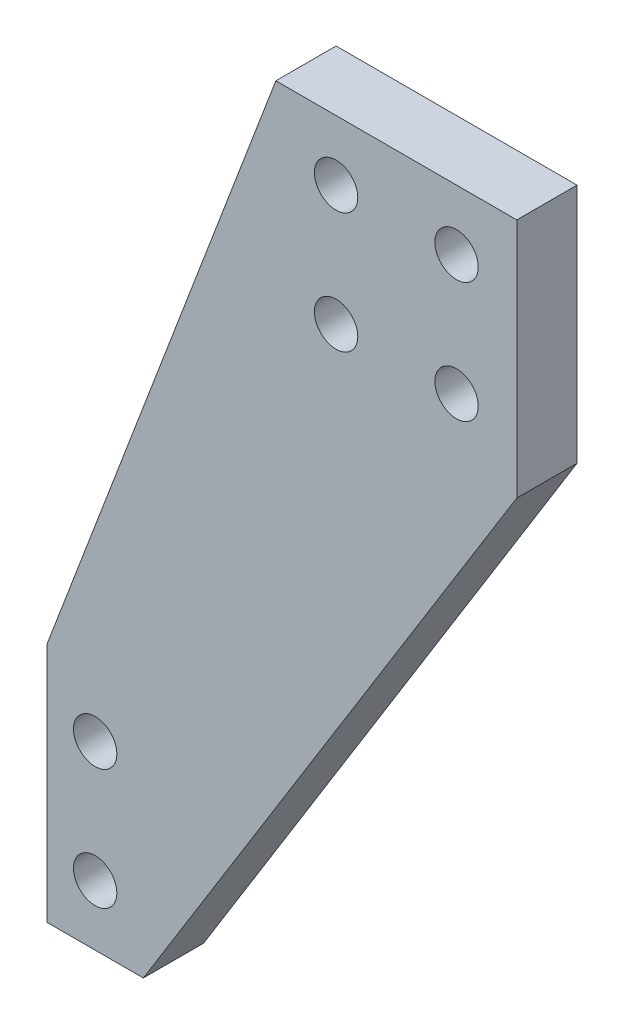
ISO-10303-21;
HEADER;
FILE_DESCRIPTION(('STEP AP214'),'2;1');
FILE_NAME('part.step','',(''),(''),'','','');
FILE_SCHEMA(('AUTOMOTIVE_DESIGN { 1 0 10303 214 1 1 1 1 }'));
ENDSEC;
DATA;
#1=APPLICATION_CONTEXT('core data for automotive mechanical design processes');
#2=APPLICATION_PROTOCOL_DEFINITION('international standard','automotive_design',2000,#1);
#3=PRODUCT_CONTEXT('',#1,'mechanical');
#4=PRODUCT('Part','Part','',(#3));
#5=PRODUCT_RELATED_PRODUCT_CATEGORY('part','',(#4));
#6=PRODUCT_DEFINITION_FORMATION('','',#4);
#7=PRODUCT_DEFINITION_CONTEXT('part definition',#1,'design');
#8=PRODUCT_DEFINITION('design','',#6,#7);
#9=PRODUCT_DEFINITION_SHAPE('','',#8);
#10=(LENGTH_UNIT() NAMED_UNIT(*) SI_UNIT(.MILLI.,.METRE.));
#11=(NAMED_UNIT(*) PLANE_ANGLE_UNIT() SI_UNIT($,.RADIAN.));
#12=(NAMED_UNIT(*) SI_UNIT($,.STERADIAN.) SOLID_ANGLE_UNIT());
#13=UNCERTAINTY_MEASURE_WITH_UNIT(LENGTH_MEASURE(1.E-05),#10,'distance_accuracy_value','');
#14=(GEOMETRIC_REPRESENTATION_CONTEXT(3) GLOBAL_UNCERTAINTY_ASSIGNED_CONTEXT((#13)) GLOBAL_UNIT_ASSIGNED_CONTEXT((#10,
#11,#12)) REPRESENTATION_CONTEXT('',''));
#15=CARTESIAN_POINT('',(0.,0.,0.));
#16=DIRECTION('',(0.,0.,1.));
#17=DIRECTION('',(1.,0.,0.));
#18=AXIS2_PLACEMENT_3D('',#15,#16,#17);
#19=CARTESIAN_POINT('',(0.,0.,6.35));
#20=DIRECTION('',(0.,0.,-1.));
#21=DIRECTION('',(-1.,0.,0.));
#22=AXIS2_PLACEMENT_3D('',#19,#20,#21);
#23=PLANE('',#22);
#24=DIRECTION('',(0.,-1.,0.));
#25=VECTOR('',#24,1.);
#26=CARTESIAN_POINT('',(0.,-25.4,6.35));
#27=LINE('',#26,#25);
#28=CARTESIAN_POINT('',(0.,0.,6.35));
#29=VERTEX_POINT('',#28);
#30=CARTESIAN_POINT('',(0.,-25.4,6.35));
#31=VERTEX_POINT('',#30);
#32=EDGE_CURVE('E164',#29,#31,#27,.T.);
#33=ORIENTED_EDGE('',*,*,#32,.T.);
#34=DIRECTION('',(1.,0.,0.));
#35=VECTOR('',#34,1.);
#36=CARTESIAN_POINT('',(10.16,-25.4,6.35));
#37=LINE('',#36,#35);
#38=CARTESIAN_POINT('',(10.16,-25.4,6.35));
#39=VERTEX_POINT('',#38);
#40=EDGE_CURVE('E109',#31,#39,#37,.T.);
#41=ORIENTED_EDGE('',*,*,#40,.T.);
#42=DIRECTION('',(0.526939668861675,0.84990269171238,0.));
#43=VECTOR('',#42,1.);
#44=CARTESIAN_POINT('',(49.53,38.1,6.35));
#45=LINE('',#44,#43);
#46=CARTESIAN_POINT('',(49.53,38.1,6.35));
#47=VERTEX_POINT('',#46);
#48=EDGE_CURVE('E123',#39,#47,#45,.T.);
#49=ORIENTED_EDGE('',*,*,#48,.T.);
#50=DIRECTION('',(0.,1.,0.));
#51=VECTOR('',#50,1.);
#52=CARTESIAN_POINT('',(49.53,63.5,6.35));
#53=LINE('',#52,#51);
#54=CARTESIAN_POINT('',(49.53,63.5,6.35));
#55=VERTEX_POINT('',#54);
#56=EDGE_CURVE('E117',#47,#55,#53,.T.);
#57=ORIENTED_EDGE('',*,*,#56,.T.);
#58=DIRECTION('',(-1.,0.,0.));
#59=VECTOR('',#58,1.);
#60=CARTESIAN_POINT('',(24.13,63.5,6.35));
#61=LINE('',#60,#59);
#62=CARTESIAN_POINT('',(24.13,63.5,6.35));
#63=VERTEX_POINT('',#62);
#64=EDGE_CURVE('E121',#55,#63,#61,.T.);
#65=ORIENTED_EDGE('',*,*,#64,.T.);
#66=DIRECTION('',(-0.355217760623573,-0.934783580588349,0.));
#67=VECTOR('',#66,1.);
#68=CARTESIAN_POINT('',(0.,0.,6.35));
#69=LINE('',#68,#67);
#70=EDGE_CURVE('E64',#63,#29,#69,.T.);
#71=ORIENTED_EDGE('',*,*,#70,.T.);
#72=EDGE_LOOP('',(#33,#41,#49,#57,#65,#71));
#73=FACE_BOUND('',#72,.T.);
#74=CARTESIAN_POINT('',(5.08,-19.05,6.35));
#75=DIRECTION('',(0.,0.,1.));
#76=DIRECTION('',(1.,0.,0.));
#77=AXIS2_PLACEMENT_3D('',#74,#75,#76);
#78=CIRCLE('',#77,2.286);
#79=CARTESIAN_POINT('',(7.366,-19.05,6.35));
#80=VERTEX_POINT('',#79);
#81=EDGE_CURVE('E152',#80,#80,#78,.T.);
#82=ORIENTED_EDGE('',*,*,#81,.F.);
#83=EDGE_LOOP('',(#82));
#84=FACE_BOUND('',#83,.T.);
#85=CARTESIAN_POINT('',(5.08,-6.35,6.35));
#86=DIRECTION('',(0.,0.,1.));
#87=DIRECTION('',(1.,0.,0.));
#88=AXIS2_PLACEMENT_3D('',#85,#86,#87);
#89=CIRCLE('',#88,2.286);
#90=CARTESIAN_POINT('',(7.366,-6.35,6.35));
#91=VERTEX_POINT('',#90);
#92=EDGE_CURVE('E259',#91,#91,#89,.T.);
#93=ORIENTED_EDGE('',*,*,#92,.F.);
#94=EDGE_LOOP('',(#93));
#95=FACE_BOUND('',#94,.T.);
#96=CARTESIAN_POINT('',(43.18,57.15,6.35));
#97=DIRECTION('',(0.,0.,1.));
#98=DIRECTION('',(1.,0.,0.));
#99=AXIS2_PLACEMENT_3D('',#96,#97,#98);
#100=CIRCLE('',#99,2.286);
#101=CARTESIAN_POINT('',(45.466,57.15,6.35));
#102=VERTEX_POINT('',#101);
#103=EDGE_CURVE('E251',#102,#102,#100,.T.);
#104=ORIENTED_EDGE('',*,*,#103,.F.);
#105=EDGE_LOOP('',(#104));
#106=FACE_BOUND('',#105,.T.);
#107=CARTESIAN_POINT('',(30.48,57.1499999999999,6.35));
#108=DIRECTION('',(0.,0.,1.));
#109=DIRECTION('',(1.,0.,0.));
#110=AXIS2_PLACEMENT_3D('',#107,#108,#109);
#111=CIRCLE('',#110,2.28599999999999);
#112=CARTESIAN_POINT('',(32.766,57.1499999999999,6.35));
#113=VERTEX_POINT('',#112);
#114=EDGE_CURVE('E244',#113,#113,#111,.T.);
#115=ORIENTED_EDGE('',*,*,#114,.F.);
#116=EDGE_LOOP('',(#115));
#117=FACE_BOUND('',#116,.T.);
#118=CARTESIAN_POINT('',(30.4800000000001,44.4499999999999,6.35));
#119=DIRECTION('',(0.,0.,1.));
#120=DIRECTION('',(1.,0.,0.));
#121=AXIS2_PLACEMENT_3D('',#118,#119,#120);
#122=CIRCLE('',#121,2.286);
#123=CARTESIAN_POINT('',(32.7660000000001,44.4499999999999,6.35));
#124=VERTEX_POINT('',#123);
#125=EDGE_CURVE('E237',#124,#124,#122,.T.);
#126=ORIENTED_EDGE('',*,*,#125,.F.);
#127=EDGE_LOOP('',(#126));
#128=FACE_BOUND('',#127,.T.);
#129=CARTESIAN_POINT('',(43.1800000000001,44.45,6.35));
#130=DIRECTION('',(0.,0.,1.));
#131=DIRECTION('',(1.,0.,0.));
#132=AXIS2_PLACEMENT_3D('',#129,#130,#131);
#133=CIRCLE('',#132,2.28599999999999);
#134=CARTESIAN_POINT('',(45.4660000000001,44.45,6.35));
#135=VERTEX_POINT('',#134);
#136=EDGE_CURVE('E224',#135,#135,#133,.T.);
#137=ORIENTED_EDGE('',*,*,#136,.F.);
#138=EDGE_LOOP('',(#137));
#139=FACE_BOUND('',#138,.T.);
#140=ADVANCED_FACE('F43',(#73,#84,#95,#106,#117,#128,#139),#23,.F.);
#141=CARTESIAN_POINT('',(0.,0.,0.));
#142=DIRECTION('',(0.,0.,-1.));
#143=DIRECTION('',(-1.,0.,0.));
#144=AXIS2_PLACEMENT_3D('',#141,#142,#143);
#145=PLANE('',#144);
#146=CARTESIAN_POINT('',(30.4800000000001,44.4499999999999,0.));
#147=DIRECTION('',(0.,0.,1.));
#148=DIRECTION('',(1.,0.,0.));
#149=AXIS2_PLACEMENT_3D('',#146,#147,#148);
#150=CIRCLE('',#149,2.286);
#151=CARTESIAN_POINT('',(32.7660000000001,44.4499999999999,0.));
#152=VERTEX_POINT('',#151);
#153=EDGE_CURVE('E234',#152,#152,#150,.T.);
#154=ORIENTED_EDGE('',*,*,#153,.T.);
#155=EDGE_LOOP('',(#154));
#156=FACE_BOUND('',#155,.T.);
#157=CARTESIAN_POINT('',(43.18,57.15,0.));
#158=DIRECTION('',(0.,0.,1.));
#159=DIRECTION('',(1.,0.,0.));
#160=AXIS2_PLACEMENT_3D('',#157,#158,#159);
#161=CIRCLE('',#160,2.286);
#162=CARTESIAN_POINT('',(45.466,57.15,0.));
#163=VERTEX_POINT('',#162);
#164=EDGE_CURVE('E248',#163,#163,#161,.T.);
#165=ORIENTED_EDGE('',*,*,#164,.T.);
#166=EDGE_LOOP('',(#165));
#167=FACE_BOUND('',#166,.T.);
#168=CARTESIAN_POINT('',(5.08,-19.05,0.));
#169=DIRECTION('',(0.,0.,1.));
#170=DIRECTION('',(1.,0.,0.));
#171=AXIS2_PLACEMENT_3D('',#168,#169,#170);
#172=CIRCLE('',#171,2.286);
#173=CARTESIAN_POINT('',(7.366,-19.05,0.));
#174=VERTEX_POINT('',#173);
#175=EDGE_CURVE('E263',#174,#174,#172,.T.);
#176=ORIENTED_EDGE('',*,*,#175,.T.);
#177=EDGE_LOOP('',(#176));
#178=FACE_BOUND('',#177,.T.);
#179=DIRECTION('',(0.,-1.,0.));
#180=VECTOR('',#179,1.);
#181=CARTESIAN_POINT('',(0.,-25.4,0.));
#182=LINE('',#181,#180);
#183=CARTESIAN_POINT('',(0.,0.,0.));
#184=VERTEX_POINT('',#183);
#185=CARTESIAN_POINT('',(0.,-25.4,0.));
#186=VERTEX_POINT('',#185);
#187=EDGE_CURVE('E147',#184,#186,#182,.T.);
#188=ORIENTED_EDGE('',*,*,#187,.F.);
#189=DIRECTION('',(-0.355217760623573,-0.934783580588349,0.));
#190=VECTOR('',#189,1.);
#191=CARTESIAN_POINT('',(0.,0.,0.));
#192=LINE('',#191,#190);
#193=CARTESIAN_POINT('',(24.13,63.5,0.));
#194=VERTEX_POINT('',#193);
#195=EDGE_CURVE('E100',#194,#184,#192,.T.);
#196=ORIENTED_EDGE('',*,*,#195,.F.);
#197=DIRECTION('',(-1.,0.,0.));
#198=VECTOR('',#197,1.);
#199=CARTESIAN_POINT('',(24.13,63.5,0.));
#200=LINE('',#199,#198);
#201=CARTESIAN_POINT('',(49.53,63.5,0.));
#202=VERTEX_POINT('',#201);
#203=EDGE_CURVE('E93',#202,#194,#200,.T.);
#204=ORIENTED_EDGE('',*,*,#203,.F.);
#205=DIRECTION('',(0.,1.,0.));
#206=VECTOR('',#205,1.);
#207=CARTESIAN_POINT('',(49.53,63.5,0.));
#208=LINE('',#207,#206);
#209=CARTESIAN_POINT('',(49.53,38.1,0.));
#210=VERTEX_POINT('',#209);
#211=EDGE_CURVE('E132',#210,#202,#208,.T.);
#212=ORIENTED_EDGE('',*,*,#211,.F.);
#213=DIRECTION('',(0.526939668861675,0.84990269171238,0.));
#214=VECTOR('',#213,1.);
#215=CARTESIAN_POINT('',(49.53,38.1,0.));
#216=LINE('',#215,#214);
#217=CARTESIAN_POINT('',(10.16,-25.4,0.));
#218=VERTEX_POINT('',#217);
#219=EDGE_CURVE('E155',#218,#210,#216,.T.);
#220=ORIENTED_EDGE('',*,*,#219,.F.);
#221=DIRECTION('',(1.,0.,0.));
#222=VECTOR('',#221,1.);
#223=CARTESIAN_POINT('',(10.16,-25.4,0.));
#224=LINE('',#223,#222);
#225=EDGE_CURVE('E151',#186,#218,#224,.T.);
#226=ORIENTED_EDGE('',*,*,#225,.F.);
#227=EDGE_LOOP('',(#188,#196,#204,#212,#220,#226));
#228=FACE_BOUND('',#227,.T.);
#229=CARTESIAN_POINT('',(5.08,-6.35,0.));
#230=DIRECTION('',(0.,0.,1.));
#231=DIRECTION('',(1.,0.,0.));
#232=AXIS2_PLACEMENT_3D('',#229,#230,#231);
#233=CIRCLE('',#232,2.286);
#234=CARTESIAN_POINT('',(7.366,-6.35,0.));
#235=VERTEX_POINT('',#234);
#236=EDGE_CURVE('E255',#235,#235,#233,.T.);
#237=ORIENTED_EDGE('',*,*,#236,.T.);
#238=EDGE_LOOP('',(#237));
#239=FACE_BOUND('',#238,.T.);
#240=CARTESIAN_POINT('',(30.48,57.1499999999999,0.));
#241=DIRECTION('',(0.,0.,1.));
#242=DIRECTION('',(1.,0.,0.));
#243=AXIS2_PLACEMENT_3D('',#240,#241,#242);
#244=CIRCLE('',#243,2.28599999999999);
#245=CARTESIAN_POINT('',(32.766,57.1499999999999,0.));
#246=VERTEX_POINT('',#245);
#247=EDGE_CURVE('E241',#246,#246,#244,.T.);
#248=ORIENTED_EDGE('',*,*,#247,.T.);
#249=EDGE_LOOP('',(#248));
#250=FACE_BOUND('',#249,.T.);
#251=CARTESIAN_POINT('',(43.1800000000001,44.45,0.));
#252=DIRECTION('',(0.,0.,1.));
#253=DIRECTION('',(1.,0.,0.));
#254=AXIS2_PLACEMENT_3D('',#251,#252,#253);
#255=CIRCLE('',#254,2.28599999999999);
#256=CARTESIAN_POINT('',(45.4660000000001,44.45,0.));
#257=VERTEX_POINT('',#256);
#258=EDGE_CURVE('E227',#257,#257,#255,.T.);
#259=ORIENTED_EDGE('',*,*,#258,.T.);
#260=EDGE_LOOP('',(#259));
#261=FACE_BOUND('',#260,.T.);
#262=ADVANCED_FACE('F176',(#156,#167,#178,#228,#239,#250,#261),#145,.T.);
#263=CARTESIAN_POINT('',(0.,-25.4,6.35));
#264=DIRECTION('',(1.,0.,0.));
#265=DIRECTION('',(0.,0.,-1.));
#266=AXIS2_PLACEMENT_3D('',#263,#264,#265);
#267=PLANE('',#266);
#268=ORIENTED_EDGE('',*,*,#187,.T.);
#269=DIRECTION('',(0.,0.,-1.));
#270=VECTOR('',#269,1.);
#271=CARTESIAN_POINT('',(0.,-25.4,6.35));
#272=LINE('',#271,#270);
#273=EDGE_CURVE('E11',#31,#186,#272,.T.);
#274=ORIENTED_EDGE('',*,*,#273,.F.);
#275=ORIENTED_EDGE('',*,*,#32,.F.);
#276=DIRECTION('',(0.,0.,-1.));
#277=VECTOR('',#276,1.);
#278=CARTESIAN_POINT('',(0.,0.,6.35));
#279=LINE('',#278,#277);
#280=EDGE_CURVE('E143',#29,#184,#279,.T.);
#281=ORIENTED_EDGE('',*,*,#280,.T.);
#282=EDGE_LOOP('',(#268,#274,#275,#281));
#283=FACE_BOUND('',#282,.T.);
#284=ADVANCED_FACE('F45',(#283),#267,.F.);
#285=CARTESIAN_POINT('',(10.16,-25.4,6.35));
#286=DIRECTION('',(0.,1.,0.));
#287=DIRECTION('',(0.,0.,1.));
#288=AXIS2_PLACEMENT_3D('',#285,#286,#287);
#289=PLANE('',#288);
#290=ORIENTED_EDGE('',*,*,#225,.T.);
#291=DIRECTION('',(0.,0.,-1.));
#292=VECTOR('',#291,1.);
#293=CARTESIAN_POINT('',(10.16,-25.4,6.35));
#294=LINE('',#293,#292);
#295=EDGE_CURVE('E53',#39,#218,#294,.T.);
#296=ORIENTED_EDGE('',*,*,#295,.F.);
#297=ORIENTED_EDGE('',*,*,#40,.F.);
#298=ORIENTED_EDGE('',*,*,#273,.T.);
#299=EDGE_LOOP('',(#290,#296,#297,#298));
#300=FACE_BOUND('',#299,.T.);
#301=ADVANCED_FACE('F352',(#300),#289,.F.);
#302=CARTESIAN_POINT('',(49.53,38.1,6.35));
#303=DIRECTION('',(-0.84990269171238,0.526939668861675,0.));
#304=DIRECTION('',(-0.526939668861675,-0.84990269171238,0.));
#305=AXIS2_PLACEMENT_3D('',#302,#303,#304);
#306=PLANE('',#305);
#307=ORIENTED_EDGE('',*,*,#219,.T.);
#308=DIRECTION('',(0.,0.,-1.));
#309=VECTOR('',#308,1.);
#310=CARTESIAN_POINT('',(49.53,38.1,6.35));
#311=LINE('',#310,#309);
#312=EDGE_CURVE('E134',#47,#210,#311,.T.);
#313=ORIENTED_EDGE('',*,*,#312,.F.);
#314=ORIENTED_EDGE('',*,*,#48,.F.);
#315=ORIENTED_EDGE('',*,*,#295,.T.);
#316=EDGE_LOOP('',(#307,#313,#314,#315));
#317=FACE_BOUND('',#316,.T.);
#318=ADVANCED_FACE('F173',(#317),#306,.F.);
#319=CARTESIAN_POINT('',(49.53,63.5,6.35));
#320=DIRECTION('',(-1.,0.,0.));
#321=DIRECTION('',(0.,0.,1.));
#322=AXIS2_PLACEMENT_3D('',#319,#320,#321);
#323=PLANE('',#322);
#324=ORIENTED_EDGE('',*,*,#211,.T.);
#325=DIRECTION('',(0.,0.,-1.));
#326=VECTOR('',#325,1.);
#327=CARTESIAN_POINT('',(49.53,63.5,6.35));
#328=LINE('',#327,#326);
#329=EDGE_CURVE('E129',#55,#202,#328,.T.);
#330=ORIENTED_EDGE('',*,*,#329,.F.);
#331=ORIENTED_EDGE('',*,*,#56,.F.);
#332=ORIENTED_EDGE('',*,*,#312,.T.);
#333=EDGE_LOOP('',(#324,#330,#331,#332));
#334=FACE_BOUND('',#333,.T.);
#335=ADVANCED_FACE('F130',(#334),#323,.F.);
#336=CARTESIAN_POINT('',(24.13,63.5,6.35));
#337=DIRECTION('',(0.,-1.,0.));
#338=DIRECTION('',(0.,0.,-1.));
#339=AXIS2_PLACEMENT_3D('',#336,#337,#338);
#340=PLANE('',#339);
#341=ORIENTED_EDGE('',*,*,#203,.T.);
#342=DIRECTION('',(0.,0.,-1.));
#343=VECTOR('',#342,1.);
#344=CARTESIAN_POINT('',(24.13,63.5,6.35));
#345=LINE('',#344,#343);
#346=EDGE_CURVE('E135',#63,#194,#345,.T.);
#347=ORIENTED_EDGE('',*,*,#346,.F.);
#348=ORIENTED_EDGE('',*,*,#64,.F.);
#349=ORIENTED_EDGE('',*,*,#329,.T.);
#350=EDGE_LOOP('',(#341,#347,#348,#349));
#351=FACE_BOUND('',#350,.T.);
#352=ADVANCED_FACE('F137',(#351),#340,.F.);
#353=CARTESIAN_POINT('',(0.,0.,6.35));
#354=DIRECTION('',(0.934783580588349,-0.355217760623573,0.));
#355=DIRECTION('',(0.355217760623573,0.934783580588349,0.));
#356=AXIS2_PLACEMENT_3D('',#353,#354,#355);
#357=PLANE('',#356);
#358=ORIENTED_EDGE('',*,*,#195,.T.);
#359=ORIENTED_EDGE('',*,*,#280,.F.);
#360=ORIENTED_EDGE('',*,*,#70,.F.);
#361=ORIENTED_EDGE('',*,*,#346,.T.);
#362=EDGE_LOOP('',(#358,#359,#360,#361));
#363=FACE_BOUND('',#362,.T.);
#364=ADVANCED_FACE('F181',(#363),#357,.F.);
#365=CARTESIAN_POINT('',(5.08,-19.05,6.35));
#366=DIRECTION('',(0.,0.,-1.));
#367=DIRECTION('',(-1.,0.,0.));
#368=AXIS2_PLACEMENT_3D('',#365,#366,#367);
#369=CYLINDRICAL_SURFACE('',#368,2.286);
#370=ORIENTED_EDGE('',*,*,#81,.T.);
#371=EDGE_LOOP('',(#370));
#372=FACE_BOUND('',#371,.T.);
#373=ORIENTED_EDGE('',*,*,#175,.F.);
#374=EDGE_LOOP('',(#373));
#375=FACE_BOUND('',#374,.T.);
#376=ADVANCED_FACE('F183',(#372,#375),#369,.F.);
#377=CARTESIAN_POINT('',(5.08,-6.35,6.35));
#378=DIRECTION('',(0.,0.,-1.));
#379=DIRECTION('',(-1.,0.,0.));
#380=AXIS2_PLACEMENT_3D('',#377,#378,#379);
#381=CYLINDRICAL_SURFACE('',#380,2.286);
#382=ORIENTED_EDGE('',*,*,#92,.T.);
#383=EDGE_LOOP('',(#382));
#384=FACE_BOUND('',#383,.T.);
#385=ORIENTED_EDGE('',*,*,#236,.F.);
#386=EDGE_LOOP('',(#385));
#387=FACE_BOUND('',#386,.T.);
#388=ADVANCED_FACE('F189',(#384,#387),#381,.F.);
#389=CARTESIAN_POINT('',(43.18,57.15,6.35));
#390=DIRECTION('',(0.,0.,-1.));
#391=DIRECTION('',(-1.,0.,0.));
#392=AXIS2_PLACEMENT_3D('',#389,#390,#391);
#393=CYLINDRICAL_SURFACE('',#392,2.286);
#394=ORIENTED_EDGE('',*,*,#103,.T.);
#395=EDGE_LOOP('',(#394));
#396=FACE_BOUND('',#395,.T.);
#397=ORIENTED_EDGE('',*,*,#164,.F.);
#398=EDGE_LOOP('',(#397));
#399=FACE_BOUND('',#398,.T.);
#400=ADVANCED_FACE('F203',(#396,#399),#393,.F.);
#401=CARTESIAN_POINT('',(30.48,57.1499999999999,6.35));
#402=DIRECTION('',(0.,0.,-1.));
#403=DIRECTION('',(-1.,0.,0.));
#404=AXIS2_PLACEMENT_3D('',#401,#402,#403);
#405=CYLINDRICAL_SURFACE('',#404,2.28599999999999);
#406=ORIENTED_EDGE('',*,*,#114,.T.);
#407=EDGE_LOOP('',(#406));
#408=FACE_BOUND('',#407,.T.);
#409=ORIENTED_EDGE('',*,*,#247,.F.);
#410=EDGE_LOOP('',(#409));
#411=FACE_BOUND('',#410,.T.);
#412=ADVANCED_FACE('F207',(#408,#411),#405,.F.);
#413=CARTESIAN_POINT('',(30.4800000000001,44.4499999999999,6.35));
#414=DIRECTION('',(0.,0.,-1.));
#415=DIRECTION('',(-1.,0.,0.));
#416=AXIS2_PLACEMENT_3D('',#413,#414,#415);
#417=CYLINDRICAL_SURFACE('',#416,2.286);
#418=ORIENTED_EDGE('',*,*,#125,.T.);
#419=EDGE_LOOP('',(#418));
#420=FACE_BOUND('',#419,.T.);
#421=ORIENTED_EDGE('',*,*,#153,.F.);
#422=EDGE_LOOP('',(#421));
#423=FACE_BOUND('',#422,.T.);
#424=ADVANCED_FACE('F211',(#420,#423),#417,.F.);
#425=CARTESIAN_POINT('',(43.1800000000001,44.45,6.35));
#426=DIRECTION('',(0.,0.,-1.));
#427=DIRECTION('',(-1.,0.,0.));
#428=AXIS2_PLACEMENT_3D('',#425,#426,#427);
#429=CYLINDRICAL_SURFACE('',#428,2.28599999999999);
#430=ORIENTED_EDGE('',*,*,#136,.T.);
#431=EDGE_LOOP('',(#430));
#432=FACE_BOUND('',#431,.T.);
#433=ORIENTED_EDGE('',*,*,#258,.F.);
#434=EDGE_LOOP('',(#433));
#435=FACE_BOUND('',#434,.T.);
#436=ADVANCED_FACE('F215',(#432,#435),#429,.F.);
#437=CLOSED_SHELL('',(#140,#262,#284,#301,#318,#335,#352,#364,#376,#388,#400,#412,#424,#436));
#438=MANIFOLD_SOLID_BREP('B2',#437);
#439=ADVANCED_BREP_SHAPE_REPRESENTATION('',(#18,#438),#14);
#440=SHAPE_DEFINITION_REPRESENTATION(#9,#439);
ENDSEC;
END-ISO-10303-21;
